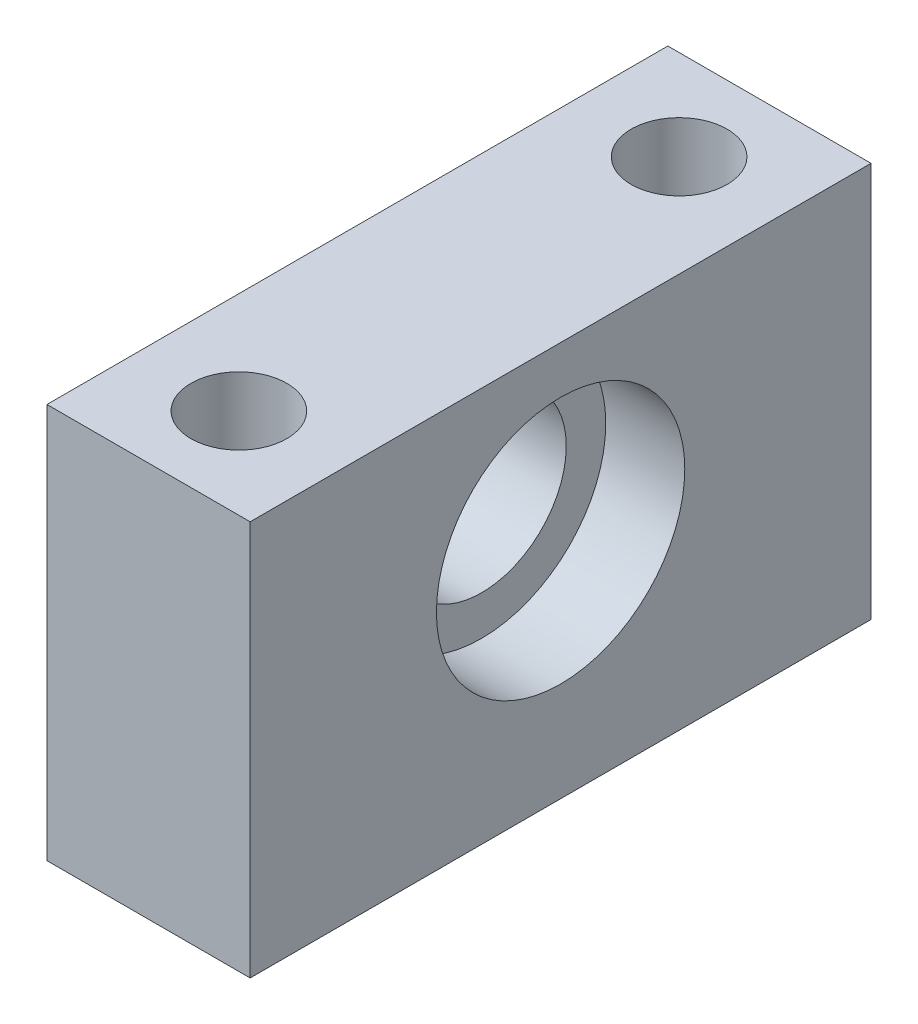
ISO-10303-21;
HEADER;
FILE_DESCRIPTION(('STEP AP214'),'2;1');
FILE_NAME('part.step','',(''),(''),'','','');
FILE_SCHEMA(('AUTOMOTIVE_DESIGN { 1 0 10303 214 1 1 1 1 }'));
ENDSEC;
DATA;
#1=APPLICATION_CONTEXT('core data for automotive mechanical design processes');
#2=APPLICATION_PROTOCOL_DEFINITION('international standard','automotive_design',2000,#1);
#3=PRODUCT_CONTEXT('',#1,'mechanical');
#4=PRODUCT('Part','Part','',(#3));
#5=PRODUCT_RELATED_PRODUCT_CATEGORY('part','',(#4));
#6=PRODUCT_DEFINITION_FORMATION('','',#4);
#7=PRODUCT_DEFINITION_CONTEXT('part definition',#1,'design');
#8=PRODUCT_DEFINITION('design','',#6,#7);
#9=PRODUCT_DEFINITION_SHAPE('','',#8);
#10=(LENGTH_UNIT() NAMED_UNIT(*) SI_UNIT(.MILLI.,.METRE.));
#11=(NAMED_UNIT(*) PLANE_ANGLE_UNIT() SI_UNIT($,.RADIAN.));
#12=(NAMED_UNIT(*) SI_UNIT($,.STERADIAN.) SOLID_ANGLE_UNIT());
#13=UNCERTAINTY_MEASURE_WITH_UNIT(LENGTH_MEASURE(1.E-05),#10,'distance_accuracy_value','');
#14=(GEOMETRIC_REPRESENTATION_CONTEXT(3) GLOBAL_UNCERTAINTY_ASSIGNED_CONTEXT((#13)) GLOBAL_UNIT_ASSIGNED_CONTEXT((#10,
#11,#12)) REPRESENTATION_CONTEXT('',''));
#15=CARTESIAN_POINT('',(0.,0.,0.));
#16=DIRECTION('',(0.,0.,1.));
#17=DIRECTION('',(1.,0.,0.));
#18=AXIS2_PLACEMENT_3D('',#15,#16,#17);
#19=CARTESIAN_POINT('',(8.99999999999999,-54.2859579694715,248.67151357404));
#20=DIRECTION('',(0.,1.,0.));
#21=DIRECTION('',(0.,0.,1.));
#22=AXIS2_PLACEMENT_3D('',#19,#20,#21);
#23=CYLINDRICAL_SURFACE('',#22,2.);
#24=CARTESIAN_POINT('',(8.99999999999999,-54.2859579694715,248.67151357404));
#25=DIRECTION('',(0.,1.,0.));
#26=DIRECTION('',(0.,0.,1.));
#27=AXIS2_PLACEMENT_3D('',#24,#25,#26);
#28=CIRCLE('',#27,2.);
#29=CARTESIAN_POINT('',(8.99999999999999,-54.2859579694715,250.67151357404));
#30=VERTEX_POINT('',#29);
#31=EDGE_CURVE('E126',#30,#30,#28,.T.);
#32=ORIENTED_EDGE('',*,*,#31,.F.);
#33=EDGE_LOOP('',(#32));
#34=FACE_BOUND('',#33,.T.);
#35=CARTESIAN_POINT('',(8.99999999999999,-31.2859579694715,248.67151357404));
#36=DIRECTION('',(0.,1.,0.));
#37=DIRECTION('',(0.,0.,1.));
#38=AXIS2_PLACEMENT_3D('',#35,#36,#37);
#39=CIRCLE('',#38,2.);
#40=CARTESIAN_POINT('',(8.99999999999999,-31.2859579694715,250.67151357404));
#41=VERTEX_POINT('',#40);
#42=EDGE_CURVE('E48',#41,#41,#39,.F.);
#43=ORIENTED_EDGE('',*,*,#42,.F.);
#44=EDGE_LOOP('',(#43));
#45=FACE_BOUND('',#44,.T.);
#46=ADVANCED_FACE('F44',(#34,#45),#23,.F.);
#47=CARTESIAN_POINT('',(8.99999999999999,-54.2859579694715,287.67151357404));
#48=DIRECTION('',(0.,1.,0.));
#49=DIRECTION('',(0.,0.,1.));
#50=AXIS2_PLACEMENT_3D('',#47,#48,#49);
#51=CYLINDRICAL_SURFACE('',#50,2.);
#52=CARTESIAN_POINT('',(8.99999999999999,-54.2859579694715,287.67151357404));
#53=DIRECTION('',(0.,1.,0.));
#54=DIRECTION('',(0.,0.,1.));
#55=AXIS2_PLACEMENT_3D('',#52,#53,#54);
#56=CIRCLE('',#55,2.);
#57=CARTESIAN_POINT('',(8.99999999999999,-54.2859579694715,289.67151357404));
#58=VERTEX_POINT('',#57);
#59=EDGE_CURVE('E131',#58,#58,#56,.T.);
#60=ORIENTED_EDGE('',*,*,#59,.F.);
#61=EDGE_LOOP('',(#60));
#62=FACE_BOUND('',#61,.T.);
#63=CARTESIAN_POINT('',(8.99999999999999,-31.2859579694715,287.67151357404));
#64=DIRECTION('',(0.,1.,0.));
#65=DIRECTION('',(0.,0.,1.));
#66=AXIS2_PLACEMENT_3D('',#63,#64,#65);
#67=CIRCLE('',#66,2.);
#68=CARTESIAN_POINT('',(8.99999999999999,-31.2859579694715,289.67151357404));
#69=VERTEX_POINT('',#68);
#70=EDGE_CURVE('E124',#69,#69,#67,.F.);
#71=ORIENTED_EDGE('',*,*,#70,.F.);
#72=EDGE_LOOP('',(#71));
#73=FACE_BOUND('',#72,.T.);
#74=ADVANCED_FACE('F169',(#62,#73),#51,.F.);
#75=CARTESIAN_POINT('',(18.,-19.2859579694715,295.67151357404));
#76=DIRECTION('',(0.,0.,-1.));
#77=DIRECTION('',(-1.,0.,0.));
#78=AXIS2_PLACEMENT_3D('',#75,#76,#77);
#79=PLANE('',#78);
#80=DIRECTION('',(0.,-1.,0.));
#81=VECTOR('',#80,1.);
#82=CARTESIAN_POINT('',(0.,-19.2859579694715,295.67151357404));
#83=LINE('',#82,#81);
#84=CARTESIAN_POINT('',(0.,-19.2859579694715,295.67151357404));
#85=VERTEX_POINT('',#84);
#86=CARTESIAN_POINT('',(0.,-54.2859579694715,295.67151357404));
#87=VERTEX_POINT('',#86);
#88=EDGE_CURVE('E111',#85,#87,#83,.T.);
#89=ORIENTED_EDGE('',*,*,#88,.T.);
#90=DIRECTION('',(-1.,0.,0.));
#91=VECTOR('',#90,1.);
#92=CARTESIAN_POINT('',(18.,-54.2859579694715,295.67151357404));
#93=LINE('',#92,#91);
#94=CARTESIAN_POINT('',(18.,-54.2859579694715,295.67151357404));
#95=VERTEX_POINT('',#94);
#96=EDGE_CURVE('E13',#95,#87,#93,.T.);
#97=ORIENTED_EDGE('',*,*,#96,.F.);
#98=DIRECTION('',(0.,-1.,0.));
#99=VECTOR('',#98,1.);
#100=CARTESIAN_POINT('',(18.,-19.2859579694715,295.67151357404));
#101=LINE('',#100,#99);
#102=CARTESIAN_POINT('',(18.,-19.2859579694715,295.67151357404));
#103=VERTEX_POINT('',#102);
#104=EDGE_CURVE('E98',#103,#95,#101,.T.);
#105=ORIENTED_EDGE('',*,*,#104,.F.);
#106=DIRECTION('',(-1.,0.,0.));
#107=VECTOR('',#106,1.);
#108=CARTESIAN_POINT('',(18.,-19.2859579694715,295.67151357404));
#109=LINE('',#108,#107);
#110=EDGE_CURVE('E107',#103,#85,#109,.T.);
#111=ORIENTED_EDGE('',*,*,#110,.T.);
#112=EDGE_LOOP('',(#89,#97,#105,#111));
#113=FACE_BOUND('',#112,.T.);
#114=ADVANCED_FACE('F46',(#113),#79,.F.);
#115=CARTESIAN_POINT('',(18.,-54.2859579694715,295.67151357404));
#116=DIRECTION('',(0.,1.,0.));
#117=DIRECTION('',(0.,0.,1.));
#118=AXIS2_PLACEMENT_3D('',#115,#116,#117);
#119=PLANE('',#118);
#120=ORIENTED_EDGE('',*,*,#31,.T.);
#121=EDGE_LOOP('',(#120));
#122=FACE_BOUND('',#121,.T.);
#123=ORIENTED_EDGE('',*,*,#59,.T.);
#124=EDGE_LOOP('',(#123));
#125=FACE_BOUND('',#124,.T.);
#126=DIRECTION('',(0.,0.,-1.));
#127=VECTOR('',#126,1.);
#128=CARTESIAN_POINT('',(0.,-54.2859579694715,295.67151357404));
#129=LINE('',#128,#127);
#130=CARTESIAN_POINT('',(0.,-54.2859579694715,240.67151357404));
#131=VERTEX_POINT('',#130);
#132=EDGE_CURVE('E102',#87,#131,#129,.T.);
#133=ORIENTED_EDGE('',*,*,#132,.T.);
#134=DIRECTION('',(-1.,0.,0.));
#135=VECTOR('',#134,1.);
#136=CARTESIAN_POINT('',(18.,-54.2859579694715,240.67151357404));
#137=LINE('',#136,#135);
#138=CARTESIAN_POINT('',(18.,-54.2859579694715,240.67151357404));
#139=VERTEX_POINT('',#138);
#140=EDGE_CURVE('E54',#139,#131,#137,.T.);
#141=ORIENTED_EDGE('',*,*,#140,.F.);
#142=DIRECTION('',(0.,0.,-1.));
#143=VECTOR('',#142,1.);
#144=CARTESIAN_POINT('',(18.,-54.2859579694715,295.67151357404));
#145=LINE('',#144,#143);
#146=EDGE_CURVE('E93',#95,#139,#145,.T.);
#147=ORIENTED_EDGE('',*,*,#146,.F.);
#148=ORIENTED_EDGE('',*,*,#96,.T.);
#149=EDGE_LOOP('',(#133,#141,#147,#148));
#150=FACE_BOUND('',#149,.T.);
#151=ADVANCED_FACE('F101',(#122,#125,#150),#119,.F.);
#152=CARTESIAN_POINT('',(18.,-19.2859579694715,240.67151357404));
#153=DIRECTION('',(0.,0.,1.));
#154=DIRECTION('',(1.,0.,0.));
#155=AXIS2_PLACEMENT_3D('',#152,#153,#154);
#156=PLANE('',#155);
#157=DIRECTION('',(0.,1.,0.));
#158=VECTOR('',#157,1.);
#159=CARTESIAN_POINT('',(0.,-19.2859579694715,240.67151357404));
#160=LINE('',#159,#158);
#161=CARTESIAN_POINT('',(0.,-19.2859579694715,240.67151357404));
#162=VERTEX_POINT('',#161);
#163=EDGE_CURVE('E80',#131,#162,#160,.T.);
#164=ORIENTED_EDGE('',*,*,#163,.T.);
#165=DIRECTION('',(-1.,0.,0.));
#166=VECTOR('',#165,1.);
#167=CARTESIAN_POINT('',(18.,-19.2859579694715,240.67151357404));
#168=LINE('',#167,#166);
#169=CARTESIAN_POINT('',(18.,-19.2859579694715,240.67151357404));
#170=VERTEX_POINT('',#169);
#171=EDGE_CURVE('E103',#170,#162,#168,.T.);
#172=ORIENTED_EDGE('',*,*,#171,.F.);
#173=DIRECTION('',(0.,1.,0.));
#174=VECTOR('',#173,1.);
#175=CARTESIAN_POINT('',(18.,-19.2859579694715,240.67151357404));
#176=LINE('',#175,#174);
#177=EDGE_CURVE('E96',#139,#170,#176,.T.);
#178=ORIENTED_EDGE('',*,*,#177,.F.);
#179=ORIENTED_EDGE('',*,*,#140,.T.);
#180=EDGE_LOOP('',(#164,#172,#178,#179));
#181=FACE_BOUND('',#180,.T.);
#182=ADVANCED_FACE('F105',(#181),#156,.F.);
#183=CARTESIAN_POINT('',(18.,-19.2859579694715,295.67151357404));
#184=DIRECTION('',(0.,-1.,0.));
#185=DIRECTION('',(0.,0.,-1.));
#186=AXIS2_PLACEMENT_3D('',#183,#184,#185);
#187=PLANE('',#186);
#188=CARTESIAN_POINT('',(8.99999999999999,-19.2859579694715,248.67151357404));
#189=DIRECTION('',(0.,1.,0.));
#190=DIRECTION('',(0.,0.,1.));
#191=AXIS2_PLACEMENT_3D('',#188,#189,#190);
#192=CIRCLE('',#191,4.25);
#193=CARTESIAN_POINT('',(8.99999999999999,-19.2859579694715,252.92151357404));
#194=VERTEX_POINT('',#193);
#195=EDGE_CURVE('E141',#194,#194,#192,.T.);
#196=ORIENTED_EDGE('',*,*,#195,.F.);
#197=EDGE_LOOP('',(#196));
#198=FACE_BOUND('',#197,.T.);
#199=CARTESIAN_POINT('',(8.99999999999999,-19.2859579694715,287.67151357404));
#200=DIRECTION('',(0.,1.,0.));
#201=DIRECTION('',(0.,0.,1.));
#202=AXIS2_PLACEMENT_3D('',#199,#200,#201);
#203=CIRCLE('',#202,4.25);
#204=CARTESIAN_POINT('',(8.99999999999999,-19.2859579694715,291.92151357404));
#205=VERTEX_POINT('',#204);
#206=EDGE_CURVE('E134',#205,#205,#203,.T.);
#207=ORIENTED_EDGE('',*,*,#206,.F.);
#208=EDGE_LOOP('',(#207));
#209=FACE_BOUND('',#208,.T.);
#210=DIRECTION('',(0.,0.,1.));
#211=VECTOR('',#210,1.);
#212=CARTESIAN_POINT('',(0.,-19.2859579694715,295.67151357404));
#213=LINE('',#212,#211);
#214=EDGE_CURVE('E86',#162,#85,#213,.T.);
#215=ORIENTED_EDGE('',*,*,#214,.T.);
#216=ORIENTED_EDGE('',*,*,#110,.F.);
#217=DIRECTION('',(0.,0.,1.));
#218=VECTOR('',#217,1.);
#219=CARTESIAN_POINT('',(18.,-19.2859579694715,295.67151357404));
#220=LINE('',#219,#218);
#221=EDGE_CURVE('E63',#170,#103,#220,.T.);
#222=ORIENTED_EDGE('',*,*,#221,.F.);
#223=ORIENTED_EDGE('',*,*,#171,.T.);
#224=EDGE_LOOP('',(#215,#216,#222,#223));
#225=FACE_BOUND('',#224,.T.);
#226=ADVANCED_FACE('F157',(#198,#209,#225),#187,.F.);
#227=CARTESIAN_POINT('',(18.,0.,0.));
#228=DIRECTION('',(1.,0.,0.));
#229=DIRECTION('',(0.,0.,-1.));
#230=AXIS2_PLACEMENT_3D('',#227,#228,#229);
#231=PLANE('',#230);
#232=CARTESIAN_POINT('',(18.,-34.4857814525323,268.17151357404));
#233=DIRECTION('',(1.,0.,0.));
#234=DIRECTION('',(0.,0.,-1.));
#235=AXIS2_PLACEMENT_3D('',#232,#233,#234);
#236=CIRCLE('',#235,11.);
#237=CARTESIAN_POINT('',(18.,-34.4857814525323,257.17151357404));
#238=VERTEX_POINT('',#237);
#239=EDGE_CURVE('E122',#238,#238,#236,.T.);
#240=ORIENTED_EDGE('',*,*,#239,.F.);
#241=EDGE_LOOP('',(#240));
#242=FACE_BOUND('',#241,.T.);
#243=ORIENTED_EDGE('',*,*,#104,.T.);
#244=ORIENTED_EDGE('',*,*,#146,.T.);
#245=ORIENTED_EDGE('',*,*,#177,.T.);
#246=ORIENTED_EDGE('',*,*,#221,.T.);
#247=EDGE_LOOP('',(#243,#244,#245,#246));
#248=FACE_BOUND('',#247,.T.);
#249=ADVANCED_FACE('F94',(#242,#248),#231,.T.);
#250=CARTESIAN_POINT('',(0.,0.,0.));
#251=DIRECTION('',(1.,0.,0.));
#252=DIRECTION('',(0.,0.,-1.));
#253=AXIS2_PLACEMENT_3D('',#250,#251,#252);
#254=PLANE('',#253);
#255=CARTESIAN_POINT('',(0.,-34.4857814525323,268.17151357404));
#256=DIRECTION('',(-1.,0.,0.));
#257=DIRECTION('',(0.,0.,1.));
#258=AXIS2_PLACEMENT_3D('',#255,#256,#257);
#259=CIRCLE('',#258,7.50000000000001);
#260=CARTESIAN_POINT('',(0.,-34.4857814525323,275.67151357404));
#261=VERTEX_POINT('',#260);
#262=EDGE_CURVE('E123',#261,#261,#259,.T.);
#263=ORIENTED_EDGE('',*,*,#262,.F.);
#264=EDGE_LOOP('',(#263));
#265=FACE_BOUND('',#264,.T.);
#266=ORIENTED_EDGE('',*,*,#88,.F.);
#267=ORIENTED_EDGE('',*,*,#214,.F.);
#268=ORIENTED_EDGE('',*,*,#163,.F.);
#269=ORIENTED_EDGE('',*,*,#132,.F.);
#270=EDGE_LOOP('',(#266,#267,#268,#269));
#271=FACE_BOUND('',#270,.T.);
#272=ADVANCED_FACE('F156',(#265,#271),#254,.F.);
#273=CARTESIAN_POINT('',(11.,-34.4857814525323,268.17151357404));
#274=DIRECTION('',(1.,0.,0.));
#275=DIRECTION('',(0.,0.,-1.));
#276=AXIS2_PLACEMENT_3D('',#273,#274,#275);
#277=CYLINDRICAL_SURFACE('',#276,11.);
#278=CARTESIAN_POINT('',(11.,-34.4857814525323,268.17151357404));
#279=DIRECTION('',(1.,0.,0.));
#280=DIRECTION('',(0.,0.,-1.));
#281=AXIS2_PLACEMENT_3D('',#278,#279,#280);
#282=CIRCLE('',#281,11.);
#283=CARTESIAN_POINT('',(11.,-34.4857814525323,257.17151357404));
#284=VERTEX_POINT('',#283);
#285=EDGE_CURVE('E114',#284,#284,#282,.T.);
#286=ORIENTED_EDGE('',*,*,#285,.F.);
#287=EDGE_LOOP('',(#286));
#288=FACE_BOUND('',#287,.T.);
#289=ORIENTED_EDGE('',*,*,#239,.T.);
#290=EDGE_LOOP('',(#289));
#291=FACE_BOUND('',#290,.T.);
#292=ADVANCED_FACE('F153',(#288,#291),#277,.F.);
#293=CARTESIAN_POINT('',(11.,-34.4857814525323,268.17151357404));
#294=DIRECTION('',(1.,0.,0.));
#295=DIRECTION('',(0.,0.,-1.));
#296=AXIS2_PLACEMENT_3D('',#293,#294,#295);
#297=PLANE('',#296);
#298=CARTESIAN_POINT('',(11.,-34.4857814525323,268.17151357404));
#299=DIRECTION('',(1.,0.,0.));
#300=DIRECTION('',(0.,0.,-1.));
#301=AXIS2_PLACEMENT_3D('',#298,#299,#300);
#302=CIRCLE('',#301,7.50000000000001);
#303=CARTESIAN_POINT('',(11.,-34.4857814525323,260.67151357404));
#304=VERTEX_POINT('',#303);
#305=EDGE_CURVE('E120',#304,#304,#302,.T.);
#306=ORIENTED_EDGE('',*,*,#305,.F.);
#307=EDGE_LOOP('',(#306));
#308=FACE_BOUND('',#307,.T.);
#309=ORIENTED_EDGE('',*,*,#285,.T.);
#310=EDGE_LOOP('',(#309));
#311=FACE_BOUND('',#310,.T.);
#312=ADVANCED_FACE('F187',(#308,#311),#297,.T.);
#313=CARTESIAN_POINT('',(18.,-34.4857814525323,268.17151357404));
#314=DIRECTION('',(-1.,0.,0.));
#315=DIRECTION('',(0.,0.,1.));
#316=AXIS2_PLACEMENT_3D('',#313,#314,#315);
#317=CYLINDRICAL_SURFACE('',#316,7.50000000000001);
#318=ORIENTED_EDGE('',*,*,#305,.T.);
#319=EDGE_LOOP('',(#318));
#320=FACE_BOUND('',#319,.T.);
#321=ORIENTED_EDGE('',*,*,#262,.T.);
#322=EDGE_LOOP('',(#321));
#323=FACE_BOUND('',#322,.T.);
#324=ADVANCED_FACE('F183',(#320,#323),#317,.F.);
#325=CARTESIAN_POINT('',(8.99999999999999,-31.2859579694715,287.67151357404));
#326=DIRECTION('',(0.,1.,0.));
#327=DIRECTION('',(0.,0.,1.));
#328=AXIS2_PLACEMENT_3D('',#325,#326,#327);
#329=PLANE('',#328);
#330=CARTESIAN_POINT('',(8.99999999999999,-31.2859579694715,287.67151357404));
#331=DIRECTION('',(0.,1.,0.));
#332=DIRECTION('',(0.,0.,1.));
#333=AXIS2_PLACEMENT_3D('',#330,#331,#332);
#334=CIRCLE('',#333,4.25);
#335=CARTESIAN_POINT('',(8.99999999999999,-31.2859579694715,291.92151357404));
#336=VERTEX_POINT('',#335);
#337=EDGE_CURVE('E127',#336,#336,#334,.T.);
#338=ORIENTED_EDGE('',*,*,#337,.T.);
#339=EDGE_LOOP('',(#338));
#340=FACE_BOUND('',#339,.T.);
#341=ORIENTED_EDGE('',*,*,#70,.T.);
#342=EDGE_LOOP('',(#341));
#343=FACE_BOUND('',#342,.T.);
#344=ADVANCED_FACE('F186',(#340,#343),#329,.T.);
#345=CARTESIAN_POINT('',(8.99999999999999,-31.2859579694715,287.67151357404));
#346=DIRECTION('',(0.,1.,0.));
#347=DIRECTION('',(0.,0.,1.));
#348=AXIS2_PLACEMENT_3D('',#345,#346,#347);
#349=CYLINDRICAL_SURFACE('',#348,4.25);
#350=ORIENTED_EDGE('',*,*,#337,.F.);
#351=EDGE_LOOP('',(#350));
#352=FACE_BOUND('',#351,.T.);
#353=ORIENTED_EDGE('',*,*,#206,.T.);
#354=EDGE_LOOP('',(#353));
#355=FACE_BOUND('',#354,.T.);
#356=ADVANCED_FACE('F180',(#352,#355),#349,.F.);
#357=CARTESIAN_POINT('',(8.99999999999999,-31.2859579694715,248.67151357404));
#358=DIRECTION('',(0.,1.,0.));
#359=DIRECTION('',(0.,0.,1.));
#360=AXIS2_PLACEMENT_3D('',#357,#358,#359);
#361=PLANE('',#360);
#362=CARTESIAN_POINT('',(8.99999999999999,-31.2859579694715,248.67151357404));
#363=DIRECTION('',(0.,1.,0.));
#364=DIRECTION('',(0.,0.,1.));
#365=AXIS2_PLACEMENT_3D('',#362,#363,#364);
#366=CIRCLE('',#365,4.25);
#367=CARTESIAN_POINT('',(8.99999999999999,-31.2859579694715,252.92151357404));
#368=VERTEX_POINT('',#367);
#369=EDGE_CURVE('E306',#368,#368,#366,.T.);
#370=ORIENTED_EDGE('',*,*,#369,.T.);
#371=EDGE_LOOP('',(#370));
#372=FACE_BOUND('',#371,.T.);
#373=ORIENTED_EDGE('',*,*,#42,.T.);
#374=EDGE_LOOP('',(#373));
#375=FACE_BOUND('',#374,.T.);
#376=ADVANCED_FACE('F220',(#372,#375),#361,.T.);
#377=CARTESIAN_POINT('',(8.99999999999999,-31.2859579694715,248.67151357404));
#378=DIRECTION('',(0.,1.,0.));
#379=DIRECTION('',(0.,0.,1.));
#380=AXIS2_PLACEMENT_3D('',#377,#378,#379);
#381=CYLINDRICAL_SURFACE('',#380,4.25);
#382=ORIENTED_EDGE('',*,*,#369,.F.);
#383=EDGE_LOOP('',(#382));
#384=FACE_BOUND('',#383,.T.);
#385=ORIENTED_EDGE('',*,*,#195,.T.);
#386=EDGE_LOOP('',(#385));
#387=FACE_BOUND('',#386,.T.);
#388=ADVANCED_FACE('F227',(#384,#387),#381,.F.);
#389=CLOSED_SHELL('',(#46,#74,#114,#151,#182,#226,#249,#272,#292,#312,#324,#344,#356,#376,#388));
#390=MANIFOLD_SOLID_BREP('B2',#389);
#391=ADVANCED_BREP_SHAPE_REPRESENTATION('',(#18,#390),#14);
#392=SHAPE_DEFINITION_REPRESENTATION(#9,#391);
ENDSEC;
END-ISO-10303-21;
